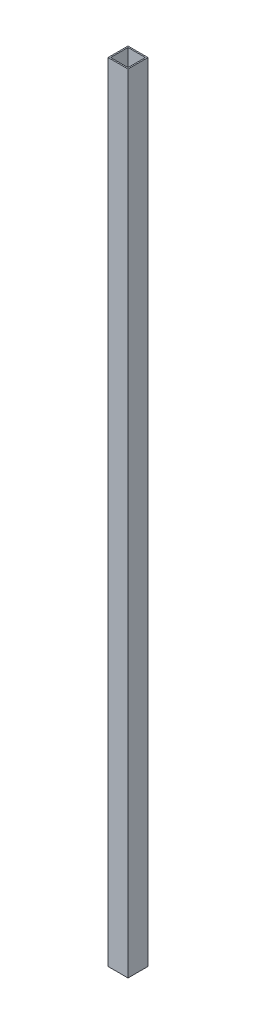
ISO-10303-21;
HEADER;
FILE_DESCRIPTION(('STEP AP214'),'2;1');
FILE_NAME('part.step','',(''),(''),'','','');
FILE_SCHEMA(('AUTOMOTIVE_DESIGN { 1 0 10303 214 1 1 1 1 }'));
ENDSEC;
DATA;
#1=APPLICATION_CONTEXT('core data for automotive mechanical design processes');
#2=APPLICATION_PROTOCOL_DEFINITION('international standard','automotive_design',2000,#1);
#3=PRODUCT_CONTEXT('',#1,'mechanical');
#4=PRODUCT('Part','Part','',(#3));
#5=PRODUCT_RELATED_PRODUCT_CATEGORY('part','',(#4));
#6=PRODUCT_DEFINITION_FORMATION('','',#4);
#7=PRODUCT_DEFINITION_CONTEXT('part definition',#1,'design');
#8=PRODUCT_DEFINITION('design','',#6,#7);
#9=PRODUCT_DEFINITION_SHAPE('','',#8);
#10=(LENGTH_UNIT() NAMED_UNIT(*) SI_UNIT(.MILLI.,.METRE.));
#11=(NAMED_UNIT(*) PLANE_ANGLE_UNIT() SI_UNIT($,.RADIAN.));
#12=(NAMED_UNIT(*) SI_UNIT($,.STERADIAN.) SOLID_ANGLE_UNIT());
#13=UNCERTAINTY_MEASURE_WITH_UNIT(LENGTH_MEASURE(1.E-05),#10,'distance_accuracy_value','');
#14=(GEOMETRIC_REPRESENTATION_CONTEXT(3) GLOBAL_UNCERTAINTY_ASSIGNED_CONTEXT((#13)) GLOBAL_UNIT_ASSIGNED_CONTEXT((#10,
#11,#12)) REPRESENTATION_CONTEXT('',''));
#15=CARTESIAN_POINT('',(0.,0.,0.));
#16=DIRECTION('',(0.,0.,1.));
#17=DIRECTION('',(1.,0.,0.));
#18=AXIS2_PLACEMENT_3D('',#15,#16,#17);
#19=CARTESIAN_POINT('',(0.,1003.3,0.));
#20=DIRECTION('',(0.,1.,0.));
#21=DIRECTION('',(0.,0.,1.));
#22=AXIS2_PLACEMENT_3D('',#19,#20,#21);
#23=PLANE('',#22);
#24=DIRECTION('',(0.,0.,1.));
#25=VECTOR('',#24,1.);
#26=CARTESIAN_POINT('',(-12.7,1003.3,12.7));
#27=LINE('',#26,#25);
#28=CARTESIAN_POINT('',(-12.7,1003.3,-12.7));
#29=VERTEX_POINT('',#28);
#30=CARTESIAN_POINT('',(-12.7,1003.3,12.7));
#31=VERTEX_POINT('',#30);
#32=EDGE_CURVE('E135',#29,#31,#27,.T.);
#33=ORIENTED_EDGE('',*,*,#32,.T.);
#34=DIRECTION('',(1.,0.,0.));
#35=VECTOR('',#34,1.);
#36=CARTESIAN_POINT('',(12.7,1003.3,12.7));
#37=LINE('',#36,#35);
#38=CARTESIAN_POINT('',(12.7,1003.3,12.7));
#39=VERTEX_POINT('',#38);
#40=EDGE_CURVE('E138',#31,#39,#37,.T.);
#41=ORIENTED_EDGE('',*,*,#40,.T.);
#42=DIRECTION('',(0.,0.,-1.));
#43=VECTOR('',#42,1.);
#44=CARTESIAN_POINT('',(12.7,1003.3,12.7));
#45=LINE('',#44,#43);
#46=CARTESIAN_POINT('',(12.7,1003.3,-12.7));
#47=VERTEX_POINT('',#46);
#48=EDGE_CURVE('E141',#39,#47,#45,.T.);
#49=ORIENTED_EDGE('',*,*,#48,.T.);
#50=DIRECTION('',(-1.,0.,0.));
#51=VECTOR('',#50,1.);
#52=CARTESIAN_POINT('',(12.7,1003.3,-12.7));
#53=LINE('',#52,#51);
#54=EDGE_CURVE('E143',#47,#29,#53,.T.);
#55=ORIENTED_EDGE('',*,*,#54,.T.);
#56=EDGE_LOOP('',(#33,#41,#49,#55));
#57=FACE_BOUND('',#56,.T.);
#58=DIRECTION('',(1.,0.,0.));
#59=VECTOR('',#58,1.);
#60=CARTESIAN_POINT('',(11.1125,1003.3,11.1125));
#61=LINE('',#60,#59);
#62=CARTESIAN_POINT('',(-11.1125,1003.3,11.1125));
#63=VERTEX_POINT('',#62);
#64=CARTESIAN_POINT('',(11.1125,1003.3,11.1125));
#65=VERTEX_POINT('',#64);
#66=EDGE_CURVE('E107',#63,#65,#61,.T.);
#67=ORIENTED_EDGE('',*,*,#66,.F.);
#68=DIRECTION('',(0.,0.,1.));
#69=VECTOR('',#68,1.);
#70=CARTESIAN_POINT('',(-11.1125,1003.3,11.1125));
#71=LINE('',#70,#69);
#72=CARTESIAN_POINT('',(-11.1125,1003.3,-11.1125));
#73=VERTEX_POINT('',#72);
#74=EDGE_CURVE('E99',#73,#63,#71,.T.);
#75=ORIENTED_EDGE('',*,*,#74,.F.);
#76=DIRECTION('',(-1.,0.,0.));
#77=VECTOR('',#76,1.);
#78=CARTESIAN_POINT('',(11.1125,1003.3,-11.1125));
#79=LINE('',#78,#77);
#80=CARTESIAN_POINT('',(11.1125,1003.3,-11.1125));
#81=VERTEX_POINT('',#80);
#82=EDGE_CURVE('E121',#81,#73,#79,.T.);
#83=ORIENTED_EDGE('',*,*,#82,.F.);
#84=DIRECTION('',(0.,0.,-1.));
#85=VECTOR('',#84,1.);
#86=CARTESIAN_POINT('',(11.1125,1003.3,11.1125));
#87=LINE('',#86,#85);
#88=EDGE_CURVE('E119',#65,#81,#87,.T.);
#89=ORIENTED_EDGE('',*,*,#88,.F.);
#90=EDGE_LOOP('',(#67,#75,#83,#89));
#91=FACE_BOUND('',#90,.T.);
#92=ADVANCED_FACE('F34',(#57,#91),#23,.T.);
#93=CARTESIAN_POINT('',(0.,0.,0.));
#94=DIRECTION('',(0.,1.,0.));
#95=DIRECTION('',(0.,0.,1.));
#96=AXIS2_PLACEMENT_3D('',#93,#94,#95);
#97=PLANE('',#96);
#98=DIRECTION('',(0.,0.,1.));
#99=VECTOR('',#98,1.);
#100=CARTESIAN_POINT('',(-12.7,0.,12.7));
#101=LINE('',#100,#99);
#102=CARTESIAN_POINT('',(-12.7,0.,-12.7));
#103=VERTEX_POINT('',#102);
#104=CARTESIAN_POINT('',(-12.7,0.,12.7));
#105=VERTEX_POINT('',#104);
#106=EDGE_CURVE('E115',#103,#105,#101,.T.);
#107=ORIENTED_EDGE('',*,*,#106,.F.);
#108=DIRECTION('',(-1.,0.,0.));
#109=VECTOR('',#108,1.);
#110=CARTESIAN_POINT('',(12.7,0.,-12.7));
#111=LINE('',#110,#109);
#112=CARTESIAN_POINT('',(12.7,0.,-12.7));
#113=VERTEX_POINT('',#112);
#114=EDGE_CURVE('E139',#113,#103,#111,.T.);
#115=ORIENTED_EDGE('',*,*,#114,.F.);
#116=DIRECTION('',(0.,0.,-1.));
#117=VECTOR('',#116,1.);
#118=CARTESIAN_POINT('',(12.7,0.,12.7));
#119=LINE('',#118,#117);
#120=CARTESIAN_POINT('',(12.7,0.,12.7));
#121=VERTEX_POINT('',#120);
#122=EDGE_CURVE('E150',#121,#113,#119,.T.);
#123=ORIENTED_EDGE('',*,*,#122,.F.);
#124=DIRECTION('',(1.,0.,0.));
#125=VECTOR('',#124,1.);
#126=CARTESIAN_POINT('',(12.7,0.,12.7));
#127=LINE('',#126,#125);
#128=EDGE_CURVE('E148',#105,#121,#127,.T.);
#129=ORIENTED_EDGE('',*,*,#128,.F.);
#130=EDGE_LOOP('',(#107,#115,#123,#129));
#131=FACE_BOUND('',#130,.T.);
#132=DIRECTION('',(0.,0.,1.));
#133=VECTOR('',#132,1.);
#134=CARTESIAN_POINT('',(-11.1125,0.,11.1125));
#135=LINE('',#134,#133);
#136=CARTESIAN_POINT('',(-11.1125,0.,-11.1125));
#137=VERTEX_POINT('',#136);
#138=CARTESIAN_POINT('',(-11.1125,0.,11.1125));
#139=VERTEX_POINT('',#138);
#140=EDGE_CURVE('E57',#137,#139,#135,.T.);
#141=ORIENTED_EDGE('',*,*,#140,.T.);
#142=DIRECTION('',(1.,0.,0.));
#143=VECTOR('',#142,1.);
#144=CARTESIAN_POINT('',(11.1125,0.,11.1125));
#145=LINE('',#144,#143);
#146=CARTESIAN_POINT('',(11.1125,0.,11.1125));
#147=VERTEX_POINT('',#146);
#148=EDGE_CURVE('E114',#139,#147,#145,.T.);
#149=ORIENTED_EDGE('',*,*,#148,.T.);
#150=DIRECTION('',(0.,0.,-1.));
#151=VECTOR('',#150,1.);
#152=CARTESIAN_POINT('',(11.1125,0.,11.1125));
#153=LINE('',#152,#151);
#154=CARTESIAN_POINT('',(11.1125,0.,-11.1125));
#155=VERTEX_POINT('',#154);
#156=EDGE_CURVE('E127',#147,#155,#153,.T.);
#157=ORIENTED_EDGE('',*,*,#156,.T.);
#158=DIRECTION('',(-1.,0.,0.));
#159=VECTOR('',#158,1.);
#160=CARTESIAN_POINT('',(11.1125,0.,-11.1125));
#161=LINE('',#160,#159);
#162=EDGE_CURVE('E108',#155,#137,#161,.T.);
#163=ORIENTED_EDGE('',*,*,#162,.T.);
#164=EDGE_LOOP('',(#141,#149,#157,#163));
#165=FACE_BOUND('',#164,.T.);
#166=ADVANCED_FACE('F168',(#131,#165),#97,.F.);
#167=CARTESIAN_POINT('',(-12.7,1003.3,12.7));
#168=DIRECTION('',(1.,0.,0.));
#169=DIRECTION('',(0.,0.,-1.));
#170=AXIS2_PLACEMENT_3D('',#167,#168,#169);
#171=PLANE('',#170);
#172=ORIENTED_EDGE('',*,*,#106,.T.);
#173=DIRECTION('',(0.,-1.,0.));
#174=VECTOR('',#173,1.);
#175=CARTESIAN_POINT('',(-12.7,1003.3,12.7));
#176=LINE('',#175,#174);
#177=EDGE_CURVE('E11',#31,#105,#176,.T.);
#178=ORIENTED_EDGE('',*,*,#177,.F.);
#179=ORIENTED_EDGE('',*,*,#32,.F.);
#180=DIRECTION('',(0.,-1.,0.));
#181=VECTOR('',#180,1.);
#182=CARTESIAN_POINT('',(-12.7,1003.3,-12.7));
#183=LINE('',#182,#181);
#184=EDGE_CURVE('E145',#29,#103,#183,.T.);
#185=ORIENTED_EDGE('',*,*,#184,.T.);
#186=EDGE_LOOP('',(#172,#178,#179,#185));
#187=FACE_BOUND('',#186,.T.);
#188=ADVANCED_FACE('F36',(#187),#171,.F.);
#189=CARTESIAN_POINT('',(12.7,1003.3,12.7));
#190=DIRECTION('',(0.,0.,-1.));
#191=DIRECTION('',(-1.,0.,0.));
#192=AXIS2_PLACEMENT_3D('',#189,#190,#191);
#193=PLANE('',#192);
#194=ORIENTED_EDGE('',*,*,#128,.T.);
#195=DIRECTION('',(0.,-1.,0.));
#196=VECTOR('',#195,1.);
#197=CARTESIAN_POINT('',(12.7,1003.3,12.7));
#198=LINE('',#197,#196);
#199=EDGE_CURVE('E42',#39,#121,#198,.T.);
#200=ORIENTED_EDGE('',*,*,#199,.F.);
#201=ORIENTED_EDGE('',*,*,#40,.F.);
#202=ORIENTED_EDGE('',*,*,#177,.T.);
#203=EDGE_LOOP('',(#194,#200,#201,#202));
#204=FACE_BOUND('',#203,.T.);
#205=ADVANCED_FACE('F178',(#204),#193,.F.);
#206=CARTESIAN_POINT('',(12.7,1003.3,12.7));
#207=DIRECTION('',(-1.,0.,0.));
#208=DIRECTION('',(0.,0.,1.));
#209=AXIS2_PLACEMENT_3D('',#206,#207,#208);
#210=PLANE('',#209);
#211=ORIENTED_EDGE('',*,*,#122,.T.);
#212=DIRECTION('',(0.,-1.,0.));
#213=VECTOR('',#212,1.);
#214=CARTESIAN_POINT('',(12.7,1003.3,-12.7));
#215=LINE('',#214,#213);
#216=EDGE_CURVE('E155',#47,#113,#215,.T.);
#217=ORIENTED_EDGE('',*,*,#216,.F.);
#218=ORIENTED_EDGE('',*,*,#48,.F.);
#219=ORIENTED_EDGE('',*,*,#199,.T.);
#220=EDGE_LOOP('',(#211,#217,#218,#219));
#221=FACE_BOUND('',#220,.T.);
#222=ADVANCED_FACE('F162',(#221),#210,.F.);
#223=CARTESIAN_POINT('',(12.7,1003.3,-12.7));
#224=DIRECTION('',(0.,0.,1.));
#225=DIRECTION('',(1.,0.,0.));
#226=AXIS2_PLACEMENT_3D('',#223,#224,#225);
#227=PLANE('',#226);
#228=ORIENTED_EDGE('',*,*,#114,.T.);
#229=ORIENTED_EDGE('',*,*,#184,.F.);
#230=ORIENTED_EDGE('',*,*,#54,.F.);
#231=ORIENTED_EDGE('',*,*,#216,.T.);
#232=EDGE_LOOP('',(#228,#229,#230,#231));
#233=FACE_BOUND('',#232,.T.);
#234=ADVANCED_FACE('F172',(#233),#227,.F.);
#235=CARTESIAN_POINT('',(-11.1125,1003.3,11.1125));
#236=DIRECTION('',(1.,0.,0.));
#237=DIRECTION('',(0.,0.,-1.));
#238=AXIS2_PLACEMENT_3D('',#235,#236,#237);
#239=PLANE('',#238);
#240=ORIENTED_EDGE('',*,*,#140,.F.);
#241=DIRECTION('',(0.,-1.,0.));
#242=VECTOR('',#241,1.);
#243=CARTESIAN_POINT('',(-11.1125,1003.3,-11.1125));
#244=LINE('',#243,#242);
#245=EDGE_CURVE('E103',#73,#137,#244,.T.);
#246=ORIENTED_EDGE('',*,*,#245,.F.);
#247=ORIENTED_EDGE('',*,*,#74,.T.);
#248=DIRECTION('',(0.,-1.,0.));
#249=VECTOR('',#248,1.);
#250=CARTESIAN_POINT('',(-11.1125,1003.3,11.1125));
#251=LINE('',#250,#249);
#252=EDGE_CURVE('E102',#63,#139,#251,.T.);
#253=ORIENTED_EDGE('',*,*,#252,.T.);
#254=EDGE_LOOP('',(#240,#246,#247,#253));
#255=FACE_BOUND('',#254,.T.);
#256=ADVANCED_FACE('F101',(#255),#239,.T.);
#257=CARTESIAN_POINT('',(11.1125,1003.3,11.1125));
#258=DIRECTION('',(0.,0.,-1.));
#259=DIRECTION('',(-1.,0.,0.));
#260=AXIS2_PLACEMENT_3D('',#257,#258,#259);
#261=PLANE('',#260);
#262=ORIENTED_EDGE('',*,*,#148,.F.);
#263=ORIENTED_EDGE('',*,*,#252,.F.);
#264=ORIENTED_EDGE('',*,*,#66,.T.);
#265=DIRECTION('',(0.,-1.,0.));
#266=VECTOR('',#265,1.);
#267=CARTESIAN_POINT('',(11.1125,1003.3,11.1125));
#268=LINE('',#267,#266);
#269=EDGE_CURVE('E116',#65,#147,#268,.T.);
#270=ORIENTED_EDGE('',*,*,#269,.T.);
#271=EDGE_LOOP('',(#262,#263,#264,#270));
#272=FACE_BOUND('',#271,.T.);
#273=ADVANCED_FACE('F111',(#272),#261,.T.);
#274=CARTESIAN_POINT('',(11.1125,1003.3,11.1125));
#275=DIRECTION('',(-1.,0.,0.));
#276=DIRECTION('',(0.,0.,1.));
#277=AXIS2_PLACEMENT_3D('',#274,#275,#276);
#278=PLANE('',#277);
#279=ORIENTED_EDGE('',*,*,#156,.F.);
#280=ORIENTED_EDGE('',*,*,#269,.F.);
#281=ORIENTED_EDGE('',*,*,#88,.T.);
#282=DIRECTION('',(0.,-1.,0.));
#283=VECTOR('',#282,1.);
#284=CARTESIAN_POINT('',(11.1125,1003.3,-11.1125));
#285=LINE('',#284,#283);
#286=EDGE_CURVE('E49',#81,#155,#285,.T.);
#287=ORIENTED_EDGE('',*,*,#286,.T.);
#288=EDGE_LOOP('',(#279,#280,#281,#287));
#289=FACE_BOUND('',#288,.T.);
#290=ADVANCED_FACE('F201',(#289),#278,.T.);
#291=CARTESIAN_POINT('',(11.1125,1003.3,-11.1125));
#292=DIRECTION('',(0.,0.,1.));
#293=DIRECTION('',(1.,0.,0.));
#294=AXIS2_PLACEMENT_3D('',#291,#292,#293);
#295=PLANE('',#294);
#296=ORIENTED_EDGE('',*,*,#162,.F.);
#297=ORIENTED_EDGE('',*,*,#286,.F.);
#298=ORIENTED_EDGE('',*,*,#82,.T.);
#299=ORIENTED_EDGE('',*,*,#245,.T.);
#300=EDGE_LOOP('',(#296,#297,#298,#299));
#301=FACE_BOUND('',#300,.T.);
#302=ADVANCED_FACE('F205',(#301),#295,.T.);
#303=CLOSED_SHELL('',(#92,#166,#188,#205,#222,#234,#256,#273,#290,#302));
#304=MANIFOLD_SOLID_BREP('B2',#303);
#305=ADVANCED_BREP_SHAPE_REPRESENTATION('',(#18,#304),#14);
#306=SHAPE_DEFINITION_REPRESENTATION(#9,#305);
ENDSEC;
END-ISO-10303-21;
